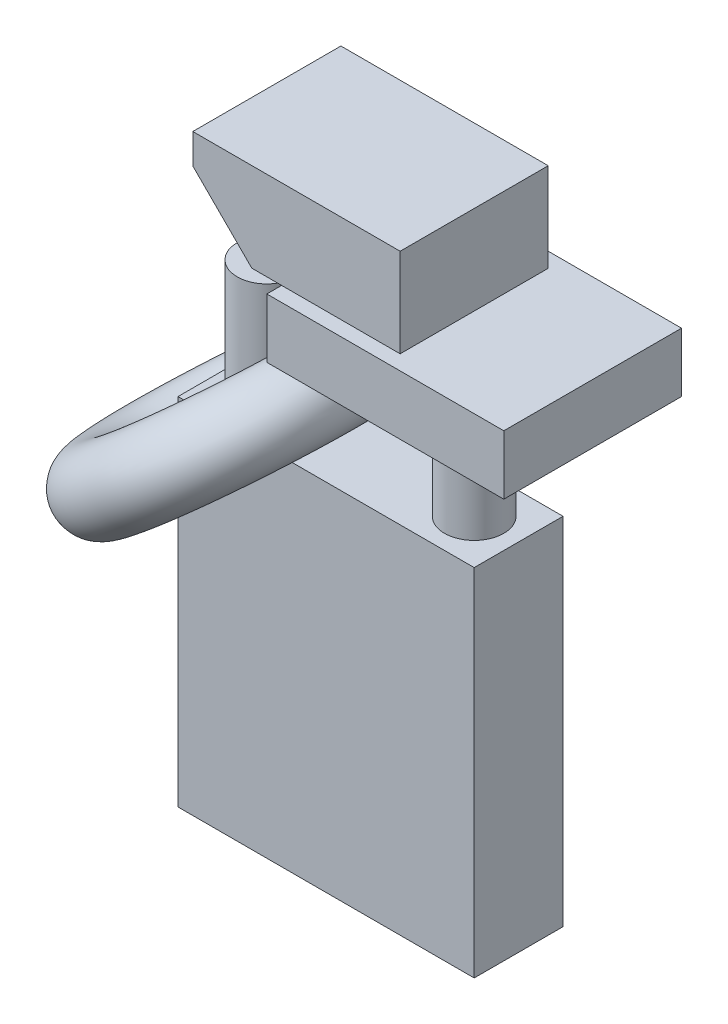
ISO-10303-21;
HEADER;
FILE_DESCRIPTION(('STEP AP214'),'2;1');
FILE_NAME('part.step','',(''),(''),'','','');
FILE_SCHEMA(('AUTOMOTIVE_DESIGN { 1 0 10303 214 1 1 1 1 }'));
ENDSEC;
DATA;
#1=APPLICATION_CONTEXT('core data for automotive mechanical design processes');
#2=APPLICATION_PROTOCOL_DEFINITION('international standard','automotive_design',2000,#1);
#3=PRODUCT_CONTEXT('',#1,'mechanical');
#4=PRODUCT('Part','Part','',(#3));
#5=PRODUCT_RELATED_PRODUCT_CATEGORY('part','',(#4));
#6=PRODUCT_DEFINITION_FORMATION('','',#4);
#7=PRODUCT_DEFINITION_CONTEXT('part definition',#1,'design');
#8=PRODUCT_DEFINITION('design','',#6,#7);
#9=PRODUCT_DEFINITION_SHAPE('','',#8);
#10=(LENGTH_UNIT() NAMED_UNIT(*) SI_UNIT(.MILLI.,.METRE.));
#11=(NAMED_UNIT(*) PLANE_ANGLE_UNIT() SI_UNIT($,.RADIAN.));
#12=(NAMED_UNIT(*) SI_UNIT($,.STERADIAN.) SOLID_ANGLE_UNIT());
#13=UNCERTAINTY_MEASURE_WITH_UNIT(LENGTH_MEASURE(1.E-05),#10,'distance_accuracy_value','');
#14=(GEOMETRIC_REPRESENTATION_CONTEXT(3) GLOBAL_UNCERTAINTY_ASSIGNED_CONTEXT((#13)) GLOBAL_UNIT_ASSIGNED_CONTEXT((#10,
#11,#12)) REPRESENTATION_CONTEXT('',''));
#15=CARTESIAN_POINT('',(0.,0.,0.));
#16=DIRECTION('',(0.,0.,1.));
#17=DIRECTION('',(1.,0.,0.));
#18=AXIS2_PLACEMENT_3D('',#15,#16,#17);
#19=CARTESIAN_POINT('',(2.38125,35.2425,0.));
#20=DIRECTION('',(-0.64018439966448,0.768221279597376,0.));
#21=DIRECTION('',(-0.768221279597376,-0.64018439966448,0.));
#22=AXIS2_PLACEMENT_3D('',#19,#20,#21);
#23=TOROIDAL_SURFACE('',#22,12.3987713605018,3.96875);
#24=CARTESIAN_POINT('',(-10.1926282034021,24.7642681638316,0.));
#25=VERTEX_POINT('',#24);
#26=VERTEX_LOOP('',#25);
#27=FACE_BOUND('',#26,.T.);
#28=ADVANCED_FACE('F49',(#27),#23,.T.);
#29=CLOSED_SHELL('',(#28));
#30=MANIFOLD_SOLID_BREP('B2',#29);
#31=CARTESIAN_POINT('',(0.,0.,4.7625));
#32=DIRECTION('',(1.,0.,0.));
#33=DIRECTION('',(0.,0.,-1.));
#34=AXIS2_PLACEMENT_3D('',#31,#32,#33);
#35=PLANE('',#34);
#36=DIRECTION('',(0.,-1.,0.));
#37=VECTOR('',#36,1.);
#38=CARTESIAN_POINT('',(0.,0.,-4.7625));
#39=LINE('',#38,#37);
#40=CARTESIAN_POINT('',(0.,38.1,-4.7625));
#41=VERTEX_POINT('',#40);
#42=CARTESIAN_POINT('',(0.,0.,-4.7625));
#43=VERTEX_POINT('',#42);
#44=EDGE_CURVE('E279',#41,#43,#39,.T.);
#45=ORIENTED_EDGE('',*,*,#44,.T.);
#46=DIRECTION('',(0.,0.,-1.));
#47=VECTOR('',#46,1.);
#48=CARTESIAN_POINT('',(0.,0.,4.7625));
#49=LINE('',#48,#47);
#50=CARTESIAN_POINT('',(0.,0.,4.7625));
#51=VERTEX_POINT('',#50);
#52=EDGE_CURVE('E317',#51,#43,#49,.T.);
#53=ORIENTED_EDGE('',*,*,#52,.F.);
#54=DIRECTION('',(0.,-1.,0.));
#55=VECTOR('',#54,1.);
#56=CARTESIAN_POINT('',(0.,0.,4.7625));
#57=LINE('',#56,#55);
#58=CARTESIAN_POINT('',(0.,38.1,4.7625));
#59=VERTEX_POINT('',#58);
#60=EDGE_CURVE('E280',#59,#51,#57,.T.);
#61=ORIENTED_EDGE('',*,*,#60,.F.);
#62=DIRECTION('',(0.,0.,-1.));
#63=VECTOR('',#62,1.);
#64=CARTESIAN_POINT('',(0.,38.1,4.7625));
#65=LINE('',#64,#63);
#66=EDGE_CURVE('E294',#59,#41,#65,.T.);
#67=ORIENTED_EDGE('',*,*,#66,.T.);
#68=EDGE_LOOP('',(#45,#53,#61,#67));
#69=FACE_BOUND('',#68,.T.);
#70=ADVANCED_FACE('F64',(#69),#35,.F.);
#71=CARTESIAN_POINT('',(0.,0.,4.7625));
#72=DIRECTION('',(0.,1.,0.));
#73=DIRECTION('',(0.,0.,1.));
#74=AXIS2_PLACEMENT_3D('',#71,#72,#73);
#75=PLANE('',#74);
#76=DIRECTION('',(1.,0.,0.));
#77=VECTOR('',#76,1.);
#78=CARTESIAN_POINT('',(0.,0.,-4.7625));
#79=LINE('',#78,#77);
#80=CARTESIAN_POINT('',(31.75,0.,-4.7625));
#81=VERTEX_POINT('',#80);
#82=EDGE_CURVE('E298',#43,#81,#79,.T.);
#83=ORIENTED_EDGE('',*,*,#82,.T.);
#84=DIRECTION('',(0.,0.,-1.));
#85=VECTOR('',#84,1.);
#86=CARTESIAN_POINT('',(31.75,0.,4.7625));
#87=LINE('',#86,#85);
#88=CARTESIAN_POINT('',(31.75,0.,4.7625));
#89=VERTEX_POINT('',#88);
#90=EDGE_CURVE('E313',#89,#81,#87,.T.);
#91=ORIENTED_EDGE('',*,*,#90,.F.);
#92=DIRECTION('',(1.,0.,0.));
#93=VECTOR('',#92,1.);
#94=CARTESIAN_POINT('',(0.,0.,4.7625));
#95=LINE('',#94,#93);
#96=EDGE_CURVE('E284',#51,#89,#95,.T.);
#97=ORIENTED_EDGE('',*,*,#96,.F.);
#98=ORIENTED_EDGE('',*,*,#52,.T.);
#99=EDGE_LOOP('',(#83,#91,#97,#98));
#100=FACE_BOUND('',#99,.T.);
#101=ADVANCED_FACE('F351',(#100),#75,.F.);
#102=CARTESIAN_POINT('',(31.75,0.,4.7625));
#103=DIRECTION('',(-1.,0.,0.));
#104=DIRECTION('',(0.,0.,1.));
#105=AXIS2_PLACEMENT_3D('',#102,#103,#104);
#106=PLANE('',#105);
#107=DIRECTION('',(0.,1.,0.));
#108=VECTOR('',#107,1.);
#109=CARTESIAN_POINT('',(31.75,0.,-4.7625));
#110=LINE('',#109,#108);
#111=CARTESIAN_POINT('',(31.75,38.1,-4.7625));
#112=VERTEX_POINT('',#111);
#113=EDGE_CURVE('E301',#81,#112,#110,.T.);
#114=ORIENTED_EDGE('',*,*,#113,.T.);
#115=DIRECTION('',(0.,0.,-1.));
#116=VECTOR('',#115,1.);
#117=CARTESIAN_POINT('',(31.75,38.1,4.7625));
#118=LINE('',#117,#116);
#119=CARTESIAN_POINT('',(31.75,38.1,4.7625));
#120=VERTEX_POINT('',#119);
#121=EDGE_CURVE('E309',#120,#112,#118,.T.);
#122=ORIENTED_EDGE('',*,*,#121,.F.);
#123=DIRECTION('',(0.,1.,0.));
#124=VECTOR('',#123,1.);
#125=CARTESIAN_POINT('',(31.75,0.,4.7625));
#126=LINE('',#125,#124);
#127=EDGE_CURVE('E288',#89,#120,#126,.T.);
#128=ORIENTED_EDGE('',*,*,#127,.F.);
#129=ORIENTED_EDGE('',*,*,#90,.T.);
#130=EDGE_LOOP('',(#114,#122,#128,#129));
#131=FACE_BOUND('',#130,.T.);
#132=ADVANCED_FACE('F335',(#131),#106,.F.);
#133=CARTESIAN_POINT('',(0.,38.1,4.7625));
#134=DIRECTION('',(0.,-1.,0.));
#135=DIRECTION('',(0.,0.,-1.));
#136=AXIS2_PLACEMENT_3D('',#133,#134,#135);
#137=PLANE('',#136);
#138=CARTESIAN_POINT('',(26.9875,38.1,0.));
#139=DIRECTION('',(0.,-1.,0.));
#140=DIRECTION('',(0.,0.,-1.));
#141=AXIS2_PLACEMENT_3D('',#138,#139,#140);
#142=CIRCLE('',#141,3.175);
#143=CARTESIAN_POINT('',(26.9875,38.1,-3.175));
#144=VERTEX_POINT('',#143);
#145=EDGE_CURVE('E67',#144,#144,#142,.F.);
#146=ORIENTED_EDGE('',*,*,#145,.F.);
#147=EDGE_LOOP('',(#146));
#148=FACE_BOUND('',#147,.T.);
#149=CARTESIAN_POINT('',(4.7625,38.1,0.));
#150=DIRECTION('',(0.,-1.,0.));
#151=DIRECTION('',(0.,0.,-1.));
#152=AXIS2_PLACEMENT_3D('',#149,#150,#151);
#153=CIRCLE('',#152,3.175);
#154=CARTESIAN_POINT('',(4.7625,38.1,-3.175));
#155=VERTEX_POINT('',#154);
#156=EDGE_CURVE('E320',#155,#155,#153,.F.);
#157=ORIENTED_EDGE('',*,*,#156,.F.);
#158=EDGE_LOOP('',(#157));
#159=FACE_BOUND('',#158,.T.);
#160=DIRECTION('',(-1.,0.,0.));
#161=VECTOR('',#160,1.);
#162=CARTESIAN_POINT('',(0.,38.1,-4.7625));
#163=LINE('',#162,#161);
#164=EDGE_CURVE('E285',#112,#41,#163,.T.);
#165=ORIENTED_EDGE('',*,*,#164,.T.);
#166=ORIENTED_EDGE('',*,*,#66,.F.);
#167=DIRECTION('',(-1.,0.,0.));
#168=VECTOR('',#167,1.);
#169=CARTESIAN_POINT('',(0.,38.1,4.7625));
#170=LINE('',#169,#168);
#171=EDGE_CURVE('E291',#120,#59,#170,.T.);
#172=ORIENTED_EDGE('',*,*,#171,.F.);
#173=ORIENTED_EDGE('',*,*,#121,.T.);
#174=EDGE_LOOP('',(#165,#166,#172,#173));
#175=FACE_BOUND('',#174,.T.);
#176=ADVANCED_FACE('F331',(#148,#159,#175),#137,.F.);
#177=CARTESIAN_POINT('',(0.,0.,4.7625));
#178=DIRECTION('',(0.,0.,-1.));
#179=DIRECTION('',(-1.,0.,0.));
#180=AXIS2_PLACEMENT_3D('',#177,#178,#179);
#181=PLANE('',#180);
#182=ORIENTED_EDGE('',*,*,#60,.T.);
#183=ORIENTED_EDGE('',*,*,#96,.T.);
#184=ORIENTED_EDGE('',*,*,#127,.T.);
#185=ORIENTED_EDGE('',*,*,#171,.T.);
#186=EDGE_LOOP('',(#182,#183,#184,#185));
#187=FACE_BOUND('',#186,.T.);
#188=ADVANCED_FACE('F334',(#187),#181,.F.);
#189=CARTESIAN_POINT('',(0.,0.,-4.7625));
#190=DIRECTION('',(0.,0.,-1.));
#191=DIRECTION('',(-1.,0.,0.));
#192=AXIS2_PLACEMENT_3D('',#189,#190,#191);
#193=PLANE('',#192);
#194=ORIENTED_EDGE('',*,*,#44,.F.);
#195=ORIENTED_EDGE('',*,*,#164,.F.);
#196=ORIENTED_EDGE('',*,*,#113,.F.);
#197=ORIENTED_EDGE('',*,*,#82,.F.);
#198=EDGE_LOOP('',(#194,#195,#196,#197));
#199=FACE_BOUND('',#198,.T.);
#200=ADVANCED_FACE('F348',(#199),#193,.T.);
#201=CARTESIAN_POINT('',(4.7625,50.8,0.));
#202=DIRECTION('',(0.,-1.,0.));
#203=DIRECTION('',(0.,0.,-1.));
#204=AXIS2_PLACEMENT_3D('',#201,#202,#203);
#205=CYLINDRICAL_SURFACE('',#204,3.175);
#206=CARTESIAN_POINT('',(7.9375,43.18,0.));
#207=VERTEX_POINT('',#206);
#208=VERTEX_LOOP('',#207);
#209=FACE_BOUND('',#208,.T.);
#210=CARTESIAN_POINT('',(4.7625,50.8,0.));
#211=DIRECTION('',(0.,1.,0.));
#212=DIRECTION('',(0.,0.,1.));
#213=AXIS2_PLACEMENT_3D('',#210,#211,#212);
#214=CIRCLE('',#213,3.175);
#215=CARTESIAN_POINT('',(4.7625,50.8,3.175));
#216=VERTEX_POINT('',#215);
#217=EDGE_CURVE('E275',#216,#216,#214,.T.);
#218=ORIENTED_EDGE('',*,*,#217,.F.);
#219=EDGE_LOOP('',(#218));
#220=FACE_BOUND('',#219,.T.);
#221=ORIENTED_EDGE('',*,*,#156,.T.);
#222=EDGE_LOOP('',(#221));
#223=FACE_BOUND('',#222,.T.);
#224=ADVANCED_FACE('F392',(#209,#220,#223),#205,.T.);
#225=CARTESIAN_POINT('',(4.7625,50.8,0.));
#226=DIRECTION('',(0.,1.,0.));
#227=DIRECTION('',(0.,0.,1.));
#228=AXIS2_PLACEMENT_3D('',#225,#226,#227);
#229=PLANE('',#228);
#230=ORIENTED_EDGE('',*,*,#217,.T.);
#231=EDGE_LOOP('',(#230));
#232=FACE_BOUND('',#231,.T.);
#233=ADVANCED_FACE('F406',(#232),#229,.T.);
#234=CARTESIAN_POINT('',(26.9875,50.8,0.));
#235=DIRECTION('',(0.,-1.,0.));
#236=DIRECTION('',(0.,0.,-1.));
#237=AXIS2_PLACEMENT_3D('',#234,#235,#236);
#238=CYLINDRICAL_SURFACE('',#237,3.175);
#239=CARTESIAN_POINT('',(26.9875,50.8,0.));
#240=DIRECTION('',(0.,1.,0.));
#241=DIRECTION('',(0.,0.,1.));
#242=AXIS2_PLACEMENT_3D('',#239,#240,#241);
#243=CIRCLE('',#242,3.175);
#244=CARTESIAN_POINT('',(26.9875,50.8,3.175));
#245=VERTEX_POINT('',#244);
#246=EDGE_CURVE('E271',#245,#245,#243,.T.);
#247=ORIENTED_EDGE('',*,*,#246,.F.);
#248=EDGE_LOOP('',(#247));
#249=FACE_BOUND('',#248,.T.);
#250=ORIENTED_EDGE('',*,*,#145,.T.);
#251=EDGE_LOOP('',(#250));
#252=FACE_BOUND('',#251,.T.);
#253=ADVANCED_FACE('F329',(#249,#252),#238,.T.);
#254=CARTESIAN_POINT('',(14.2875,57.15,9.525));
#255=DIRECTION('',(1.,0.,0.));
#256=DIRECTION('',(0.,0.,-1.));
#257=AXIS2_PLACEMENT_3D('',#254,#255,#256);
#258=PLANE('',#257);
#259=DIRECTION('',(0.,-1.,0.));
#260=VECTOR('',#259,1.);
#261=CARTESIAN_POINT('',(14.2875,57.15,-9.525));
#262=LINE('',#261,#260);
#263=CARTESIAN_POINT('',(14.2875,57.15,-9.525));
#264=VERTEX_POINT('',#263);
#265=CARTESIAN_POINT('',(14.2875,50.8,-9.525));
#266=VERTEX_POINT('',#265);
#267=EDGE_CURVE('E172',#264,#266,#262,.T.);
#268=ORIENTED_EDGE('',*,*,#267,.T.);
#269=DIRECTION('',(0.,0.,-1.));
#270=VECTOR('',#269,1.);
#271=CARTESIAN_POINT('',(14.2875,50.8,9.525));
#272=LINE('',#271,#270);
#273=CARTESIAN_POINT('',(14.2875,50.8,9.525));
#274=VERTEX_POINT('',#273);
#275=EDGE_CURVE('E267',#274,#266,#272,.T.);
#276=ORIENTED_EDGE('',*,*,#275,.F.);
#277=DIRECTION('',(0.,-1.,0.));
#278=VECTOR('',#277,1.);
#279=CARTESIAN_POINT('',(14.2875,57.15,9.525));
#280=LINE('',#279,#278);
#281=CARTESIAN_POINT('',(14.2875,57.15,9.525));
#282=VERTEX_POINT('',#281);
#283=EDGE_CURVE('E228',#282,#274,#280,.T.);
#284=ORIENTED_EDGE('',*,*,#283,.F.);
#285=DIRECTION('',(0.,0.,-1.));
#286=VECTOR('',#285,1.);
#287=CARTESIAN_POINT('',(14.2875,57.15,9.525));
#288=LINE('',#287,#286);
#289=CARTESIAN_POINT('',(14.2875,57.15,7.9375));
#290=VERTEX_POINT('',#289);
#291=EDGE_CURVE('E255',#282,#290,#288,.T.);
#292=ORIENTED_EDGE('',*,*,#291,.T.);
#293=CARTESIAN_POINT('',(14.2875,57.15,-7.93749999999999));
#294=VERTEX_POINT('',#293);
#295=EDGE_CURVE('E259',#290,#294,#288,.T.);
#296=ORIENTED_EDGE('',*,*,#295,.T.);
#297=EDGE_CURVE('E242',#294,#264,#288,.T.);
#298=ORIENTED_EDGE('',*,*,#297,.T.);
#299=EDGE_LOOP('',(#268,#276,#284,#292,#296,#298));
#300=FACE_BOUND('',#299,.T.);
#301=ADVANCED_FACE('F421',(#300),#258,.F.);
#302=CARTESIAN_POINT('',(14.2875,50.8,9.525));
#303=DIRECTION('',(0.,1.,0.));
#304=DIRECTION('',(0.,0.,1.));
#305=AXIS2_PLACEMENT_3D('',#302,#303,#304);
#306=PLANE('',#305);
#307=ORIENTED_EDGE('',*,*,#246,.T.);
#308=EDGE_LOOP('',(#307));
#309=FACE_BOUND('',#308,.T.);
#310=DIRECTION('',(1.,0.,0.));
#311=VECTOR('',#310,1.);
#312=CARTESIAN_POINT('',(14.2875,50.8,-9.525));
#313=LINE('',#312,#311);
#314=CARTESIAN_POINT('',(39.6875,50.8,-9.525));
#315=VERTEX_POINT('',#314);
#316=EDGE_CURVE('E246',#266,#315,#313,.T.);
#317=ORIENTED_EDGE('',*,*,#316,.T.);
#318=DIRECTION('',(0.,0.,-1.));
#319=VECTOR('',#318,1.);
#320=CARTESIAN_POINT('',(39.6875,50.8,9.525));
#321=LINE('',#320,#319);
#322=CARTESIAN_POINT('',(39.6875,50.8,9.525));
#323=VERTEX_POINT('',#322);
#324=EDGE_CURVE('E263',#323,#315,#321,.T.);
#325=ORIENTED_EDGE('',*,*,#324,.F.);
#326=DIRECTION('',(1.,0.,0.));
#327=VECTOR('',#326,1.);
#328=CARTESIAN_POINT('',(14.2875,50.8,9.525));
#329=LINE('',#328,#327);
#330=EDGE_CURVE('E232',#274,#323,#329,.T.);
#331=ORIENTED_EDGE('',*,*,#330,.F.);
#332=ORIENTED_EDGE('',*,*,#275,.T.);
#333=EDGE_LOOP('',(#317,#325,#331,#332));
#334=FACE_BOUND('',#333,.T.);
#335=ADVANCED_FACE('F430',(#309,#334),#306,.F.);
#336=CARTESIAN_POINT('',(39.6875,57.15,9.525));
#337=DIRECTION('',(-1.,0.,0.));
#338=DIRECTION('',(0.,-1.,0.));
#339=AXIS2_PLACEMENT_3D('',#336,#337,#338);
#340=PLANE('',#339);
#341=DIRECTION('',(0.,1.,0.));
#342=VECTOR('',#341,1.);
#343=CARTESIAN_POINT('',(39.6875,57.15,-9.525));
#344=LINE('',#343,#342);
#345=CARTESIAN_POINT('',(39.6875,57.15,-9.525));
#346=VERTEX_POINT('',#345);
#347=EDGE_CURVE('E249',#315,#346,#344,.T.);
#348=ORIENTED_EDGE('',*,*,#347,.T.);
#349=DIRECTION('',(0.,0.,-1.));
#350=VECTOR('',#349,1.);
#351=CARTESIAN_POINT('',(39.6875,57.15,9.525));
#352=LINE('',#351,#350);
#353=CARTESIAN_POINT('',(39.6875,57.15,9.525));
#354=VERTEX_POINT('',#353);
#355=EDGE_CURVE('E258',#354,#346,#352,.T.);
#356=ORIENTED_EDGE('',*,*,#355,.F.);
#357=DIRECTION('',(0.,1.,0.));
#358=VECTOR('',#357,1.);
#359=CARTESIAN_POINT('',(39.6875,57.15,9.525));
#360=LINE('',#359,#358);
#361=EDGE_CURVE('E236',#323,#354,#360,.T.);
#362=ORIENTED_EDGE('',*,*,#361,.F.);
#363=ORIENTED_EDGE('',*,*,#324,.T.);
#364=EDGE_LOOP('',(#348,#356,#362,#363));
#365=FACE_BOUND('',#364,.T.);
#366=ADVANCED_FACE('F435',(#365),#340,.F.);
#367=CARTESIAN_POINT('',(14.2875,57.15,9.525));
#368=DIRECTION('',(0.,-1.,0.));
#369=DIRECTION('',(0.,0.,-1.));
#370=AXIS2_PLACEMENT_3D('',#367,#368,#369);
#371=PLANE('',#370);
#372=ORIENTED_EDGE('',*,*,#297,.F.);
#373=DIRECTION('',(1.,0.,0.));
#374=VECTOR('',#373,1.);
#375=CARTESIAN_POINT('',(11.0871,57.15,-7.9375));
#376=LINE('',#375,#374);
#377=CARTESIAN_POINT('',(26.9875,57.15,-7.9375));
#378=VERTEX_POINT('',#377);
#379=EDGE_CURVE('E47',#294,#378,#376,.T.);
#380=ORIENTED_EDGE('',*,*,#379,.T.);
#381=DIRECTION('',(0.,0.,-1.));
#382=VECTOR('',#381,1.);
#383=CARTESIAN_POINT('',(26.9875,57.15,7.9375));
#384=LINE('',#383,#382);
#385=CARTESIAN_POINT('',(26.9875,57.15,7.9375));
#386=VERTEX_POINT('',#385);
#387=EDGE_CURVE('E164',#386,#378,#384,.T.);
#388=ORIENTED_EDGE('',*,*,#387,.F.);
#389=DIRECTION('',(1.,0.,0.));
#390=VECTOR('',#389,1.);
#391=CARTESIAN_POINT('',(11.0871,57.15,7.9375));
#392=LINE('',#391,#390);
#393=EDGE_CURVE('E73',#290,#386,#392,.T.);
#394=ORIENTED_EDGE('',*,*,#393,.F.);
#395=ORIENTED_EDGE('',*,*,#291,.F.);
#396=DIRECTION('',(-1.,0.,0.));
#397=VECTOR('',#396,1.);
#398=CARTESIAN_POINT('',(14.2875,57.15,9.525));
#399=LINE('',#398,#397);
#400=EDGE_CURVE('E239',#354,#282,#399,.T.);
#401=ORIENTED_EDGE('',*,*,#400,.F.);
#402=ORIENTED_EDGE('',*,*,#355,.T.);
#403=DIRECTION('',(-1.,0.,0.));
#404=VECTOR('',#403,1.);
#405=CARTESIAN_POINT('',(14.2875,57.15,-9.525));
#406=LINE('',#405,#404);
#407=EDGE_CURVE('E233',#346,#264,#406,.T.);
#408=ORIENTED_EDGE('',*,*,#407,.T.);
#409=EDGE_LOOP('',(#372,#380,#388,#394,#395,#401,#402,#408));
#410=FACE_BOUND('',#409,.T.);
#411=ADVANCED_FACE('F166',(#410),#371,.F.);
#412=CARTESIAN_POINT('',(0.,0.,9.525));
#413=DIRECTION('',(0.,0.,1.));
#414=DIRECTION('',(1.,0.,0.));
#415=AXIS2_PLACEMENT_3D('',#412,#413,#414);
#416=PLANE('',#415);
#417=ORIENTED_EDGE('',*,*,#283,.T.);
#418=ORIENTED_EDGE('',*,*,#330,.T.);
#419=ORIENTED_EDGE('',*,*,#361,.T.);
#420=ORIENTED_EDGE('',*,*,#400,.T.);
#421=EDGE_LOOP('',(#417,#418,#419,#420));
#422=FACE_BOUND('',#421,.T.);
#423=ADVANCED_FACE('F454',(#422),#416,.T.);
#424=CARTESIAN_POINT('',(0.,0.,-9.525));
#425=DIRECTION('',(0.,0.,1.));
#426=DIRECTION('',(1.,0.,0.));
#427=AXIS2_PLACEMENT_3D('',#424,#425,#426);
#428=PLANE('',#427);
#429=ORIENTED_EDGE('',*,*,#267,.F.);
#430=ORIENTED_EDGE('',*,*,#407,.F.);
#431=ORIENTED_EDGE('',*,*,#347,.F.);
#432=ORIENTED_EDGE('',*,*,#316,.F.);
#433=EDGE_LOOP('',(#429,#430,#431,#432));
#434=FACE_BOUND('',#433,.T.);
#435=ADVANCED_FACE('F459',(#434),#428,.F.);
#436=CARTESIAN_POINT('',(11.0871,57.15,7.9375));
#437=DIRECTION('',(0.,1.,0.));
#438=DIRECTION('',(0.,0.,1.));
#439=AXIS2_PLACEMENT_3D('',#436,#437,#438);
#440=PLANE('',#439);
#441=ORIENTED_EDGE('',*,*,#295,.F.);
#442=CARTESIAN_POINT('',(11.0871,57.15,7.9375));
#443=VERTEX_POINT('',#442);
#444=EDGE_CURVE('E181',#443,#290,#392,.T.);
#445=ORIENTED_EDGE('',*,*,#444,.F.);
#446=DIRECTION('',(0.,0.,-1.));
#447=VECTOR('',#446,1.);
#448=CARTESIAN_POINT('',(11.0871,57.15,7.9375));
#449=LINE('',#448,#447);
#450=CARTESIAN_POINT('',(11.0871,57.15,-7.9375));
#451=VERTEX_POINT('',#450);
#452=EDGE_CURVE('E200',#443,#451,#449,.T.);
#453=ORIENTED_EDGE('',*,*,#452,.T.);
#454=EDGE_CURVE('E75',#451,#294,#376,.T.);
#455=ORIENTED_EDGE('',*,*,#454,.T.);
#456=EDGE_LOOP('',(#441,#445,#453,#455));
#457=FACE_BOUND('',#456,.T.);
#458=ADVANCED_FACE('F470',(#457),#440,.F.);
#459=CARTESIAN_POINT('',(26.9875,57.15,7.9375));
#460=DIRECTION('',(-1.,0.,0.));
#461=DIRECTION('',(0.,0.,1.));
#462=AXIS2_PLACEMENT_3D('',#459,#460,#461);
#463=PLANE('',#462);
#464=DIRECTION('',(0.,1.,0.));
#465=VECTOR('',#464,1.);
#466=CARTESIAN_POINT('',(26.9875,57.15,-7.9375));
#467=LINE('',#466,#465);
#468=CARTESIAN_POINT('',(26.9875,66.675,-7.9375));
#469=VERTEX_POINT('',#468);
#470=EDGE_CURVE('E204',#378,#469,#467,.T.);
#471=ORIENTED_EDGE('',*,*,#470,.T.);
#472=DIRECTION('',(0.,0.,-1.));
#473=VECTOR('',#472,1.);
#474=CARTESIAN_POINT('',(26.9875,66.675,7.9375));
#475=LINE('',#474,#473);
#476=CARTESIAN_POINT('',(26.9875,66.675,7.9375));
#477=VERTEX_POINT('',#476);
#478=EDGE_CURVE('E173',#477,#469,#475,.T.);
#479=ORIENTED_EDGE('',*,*,#478,.F.);
#480=DIRECTION('',(0.,1.,0.));
#481=VECTOR('',#480,1.);
#482=CARTESIAN_POINT('',(26.9875,57.15,7.9375));
#483=LINE('',#482,#481);
#484=EDGE_CURVE('E178',#386,#477,#483,.T.);
#485=ORIENTED_EDGE('',*,*,#484,.F.);
#486=ORIENTED_EDGE('',*,*,#387,.T.);
#487=EDGE_LOOP('',(#471,#479,#485,#486));
#488=FACE_BOUND('',#487,.T.);
#489=ADVANCED_FACE('F184',(#488),#463,.F.);
#490=CARTESIAN_POINT('',(26.9875,66.675,7.9375));
#491=DIRECTION('',(0.,-1.,0.));
#492=DIRECTION('',(0.,0.,-1.));
#493=AXIS2_PLACEMENT_3D('',#490,#491,#492);
#494=PLANE('',#493);
#495=DIRECTION('',(-1.,0.,0.));
#496=VECTOR('',#495,1.);
#497=CARTESIAN_POINT('',(26.9875,66.675,-7.9375));
#498=LINE('',#497,#496);
#499=CARTESIAN_POINT('',(4.76249999999999,66.675,-7.9375));
#500=VERTEX_POINT('',#499);
#501=EDGE_CURVE('E207',#469,#500,#498,.T.);
#502=ORIENTED_EDGE('',*,*,#501,.T.);
#503=DIRECTION('',(0.,0.,-1.));
#504=VECTOR('',#503,1.);
#505=CARTESIAN_POINT('',(4.76249999999999,66.675,7.9375));
#506=LINE('',#505,#504);
#507=CARTESIAN_POINT('',(4.76249999999999,66.675,7.9375));
#508=VERTEX_POINT('',#507);
#509=EDGE_CURVE('E222',#508,#500,#506,.T.);
#510=ORIENTED_EDGE('',*,*,#509,.F.);
#511=DIRECTION('',(-1.,0.,0.));
#512=VECTOR('',#511,1.);
#513=CARTESIAN_POINT('',(26.9875,66.675,7.9375));
#514=LINE('',#513,#512);
#515=EDGE_CURVE('E188',#477,#508,#514,.T.);
#516=ORIENTED_EDGE('',*,*,#515,.F.);
#517=ORIENTED_EDGE('',*,*,#478,.T.);
#518=EDGE_LOOP('',(#502,#510,#516,#517));
#519=FACE_BOUND('',#518,.T.);
#520=ADVANCED_FACE('F506',(#519),#494,.F.);
#521=CARTESIAN_POINT('',(4.76249999999999,66.675,7.9375));
#522=DIRECTION('',(1.,0.,0.));
#523=DIRECTION('',(0.,1.,0.));
#524=AXIS2_PLACEMENT_3D('',#521,#522,#523);
#525=PLANE('',#524);
#526=DIRECTION('',(0.,-1.,0.));
#527=VECTOR('',#526,1.);
#528=CARTESIAN_POINT('',(4.76249999999999,66.675,-7.9375));
#529=LINE('',#528,#527);
#530=CARTESIAN_POINT('',(4.76249999999999,63.4746,-7.9375));
#531=VERTEX_POINT('',#530);
#532=EDGE_CURVE('E210',#500,#531,#529,.T.);
#533=ORIENTED_EDGE('',*,*,#532,.T.);
#534=DIRECTION('',(0.,0.,-1.));
#535=VECTOR('',#534,1.);
#536=CARTESIAN_POINT('',(4.76249999999999,63.4746,7.9375));
#537=LINE('',#536,#535);
#538=CARTESIAN_POINT('',(4.76249999999999,63.4746,7.9375));
#539=VERTEX_POINT('',#538);
#540=EDGE_CURVE('E218',#539,#531,#537,.T.);
#541=ORIENTED_EDGE('',*,*,#540,.F.);
#542=DIRECTION('',(0.,-1.,0.));
#543=VECTOR('',#542,1.);
#544=CARTESIAN_POINT('',(4.76249999999999,66.675,7.9375));
#545=LINE('',#544,#543);
#546=EDGE_CURVE('E192',#508,#539,#545,.T.);
#547=ORIENTED_EDGE('',*,*,#546,.F.);
#548=ORIENTED_EDGE('',*,*,#509,.T.);
#549=EDGE_LOOP('',(#533,#541,#547,#548));
#550=FACE_BOUND('',#549,.T.);
#551=ADVANCED_FACE('F516',(#550),#525,.F.);
#552=CARTESIAN_POINT('',(4.76249999999999,63.4746,7.9375));
#553=DIRECTION('',(0.707106781186547,0.707106781186548,0.));
#554=DIRECTION('',(-0.707106781186548,0.707106781186547,0.));
#555=AXIS2_PLACEMENT_3D('',#552,#553,#554);
#556=PLANE('',#555);
#557=DIRECTION('',(0.707106781186548,-0.707106781186547,0.));
#558=VECTOR('',#557,1.);
#559=CARTESIAN_POINT('',(4.76249999999999,63.4746,-7.9375));
#560=LINE('',#559,#558);
#561=EDGE_CURVE('E194',#531,#451,#560,.T.);
#562=ORIENTED_EDGE('',*,*,#561,.T.);
#563=ORIENTED_EDGE('',*,*,#452,.F.);
#564=DIRECTION('',(0.707106781186548,-0.707106781186547,0.));
#565=VECTOR('',#564,1.);
#566=CARTESIAN_POINT('',(4.76249999999999,63.4746,7.9375));
#567=LINE('',#566,#565);
#568=EDGE_CURVE('E198',#539,#443,#567,.T.);
#569=ORIENTED_EDGE('',*,*,#568,.F.);
#570=ORIENTED_EDGE('',*,*,#540,.T.);
#571=EDGE_LOOP('',(#562,#563,#569,#570));
#572=FACE_BOUND('',#571,.T.);
#573=ADVANCED_FACE('F527',(#572),#556,.F.);
#574=CARTESIAN_POINT('',(0.,0.,7.9375));
#575=DIRECTION('',(0.,0.,1.));
#576=DIRECTION('',(1.,0.,0.));
#577=AXIS2_PLACEMENT_3D('',#574,#575,#576);
#578=PLANE('',#577);
#579=ORIENTED_EDGE('',*,*,#444,.T.);
#580=ORIENTED_EDGE('',*,*,#393,.T.);
#581=ORIENTED_EDGE('',*,*,#484,.T.);
#582=ORIENTED_EDGE('',*,*,#515,.T.);
#583=ORIENTED_EDGE('',*,*,#546,.T.);
#584=ORIENTED_EDGE('',*,*,#568,.T.);
#585=EDGE_LOOP('',(#579,#580,#581,#582,#583,#584));
#586=FACE_BOUND('',#585,.T.);
#587=ADVANCED_FACE('F177',(#586),#578,.T.);
#588=CARTESIAN_POINT('',(0.,0.,-7.9375));
#589=DIRECTION('',(0.,0.,1.));
#590=DIRECTION('',(1.,0.,0.));
#591=AXIS2_PLACEMENT_3D('',#588,#589,#590);
#592=PLANE('',#591);
#593=ORIENTED_EDGE('',*,*,#454,.F.);
#594=ORIENTED_EDGE('',*,*,#561,.F.);
#595=ORIENTED_EDGE('',*,*,#532,.F.);
#596=ORIENTED_EDGE('',*,*,#501,.F.);
#597=ORIENTED_EDGE('',*,*,#470,.F.);
#598=ORIENTED_EDGE('',*,*,#379,.F.);
#599=EDGE_LOOP('',(#593,#594,#595,#596,#597,#598));
#600=FACE_BOUND('',#599,.T.);
#601=ADVANCED_FACE('F548',(#600),#592,.F.);
#602=CLOSED_SHELL('',(#70,#101,#132,#176,#188,#200,#224,#233,#253,#301,#335,#366,#411,#423,#435,
#458,#489,#520,#551,#573,#587,#601));
#603=MANIFOLD_SOLID_BREP('B6',#602);
#604=ADVANCED_BREP_SHAPE_REPRESENTATION('',(#18,#30,#603),#14);
#605=SHAPE_DEFINITION_REPRESENTATION(#9,#604);
ENDSEC;
END-ISO-10303-21;
